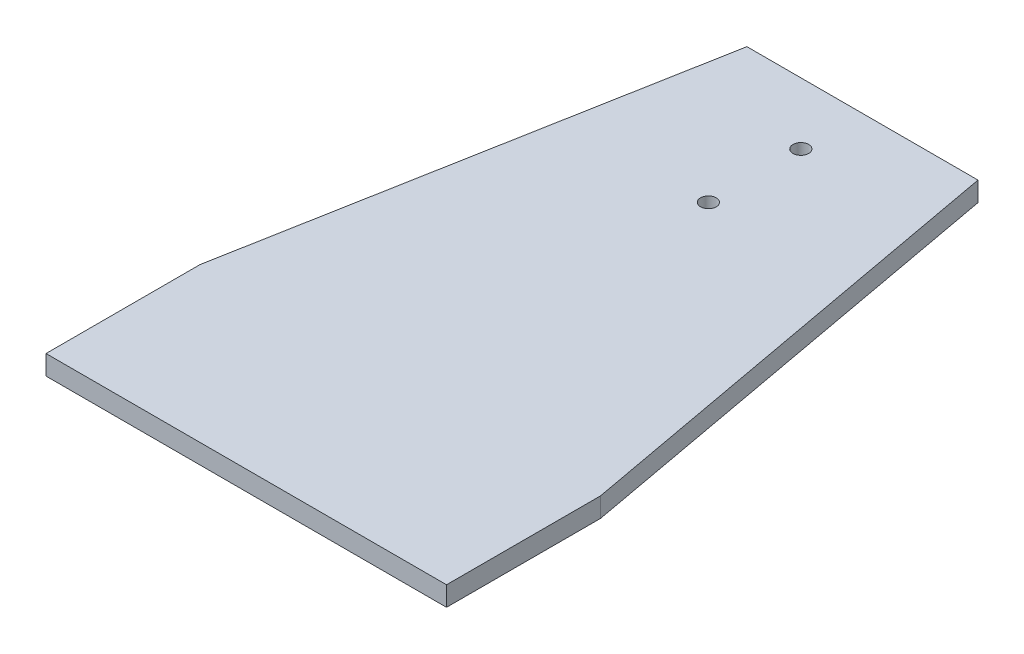
ISO-10303-21;
HEADER;
FILE_DESCRIPTION(('STEP AP214'),'2;1');
FILE_NAME('part.step','',(''),(''),'','','');
FILE_SCHEMA(('AUTOMOTIVE_DESIGN { 1 0 10303 214 1 1 1 1 }'));
ENDSEC;
DATA;
#1=APPLICATION_CONTEXT('core data for automotive mechanical design processes');
#2=APPLICATION_PROTOCOL_DEFINITION('international standard','automotive_design',2000,#1);
#3=PRODUCT_CONTEXT('',#1,'mechanical');
#4=PRODUCT('Part','Part','',(#3));
#5=PRODUCT_RELATED_PRODUCT_CATEGORY('part','',(#4));
#6=PRODUCT_DEFINITION_FORMATION('','',#4);
#7=PRODUCT_DEFINITION_CONTEXT('part definition',#1,'design');
#8=PRODUCT_DEFINITION('design','',#6,#7);
#9=PRODUCT_DEFINITION_SHAPE('','',#8);
#10=(LENGTH_UNIT() NAMED_UNIT(*) SI_UNIT(.MILLI.,.METRE.));
#11=(NAMED_UNIT(*) PLANE_ANGLE_UNIT() SI_UNIT($,.RADIAN.));
#12=(NAMED_UNIT(*) SI_UNIT($,.STERADIAN.) SOLID_ANGLE_UNIT());
#13=UNCERTAINTY_MEASURE_WITH_UNIT(LENGTH_MEASURE(1.E-05),#10,'distance_accuracy_value','');
#14=(GEOMETRIC_REPRESENTATION_CONTEXT(3) GLOBAL_UNCERTAINTY_ASSIGNED_CONTEXT((#13)) GLOBAL_UNIT_ASSIGNED_CONTEXT((#10,
#11,#12)) REPRESENTATION_CONTEXT('',''));
#15=CARTESIAN_POINT('',(0.,0.,0.));
#16=DIRECTION('',(0.,0.,1.));
#17=DIRECTION('',(1.,0.,0.));
#18=AXIS2_PLACEMENT_3D('',#15,#16,#17);
#19=CARTESIAN_POINT('',(0.,6.35,0.));
#20=DIRECTION('',(0.,1.,0.));
#21=DIRECTION('',(0.,0.,1.));
#22=AXIS2_PLACEMENT_3D('',#19,#20,#21);
#23=PLANE('',#22);
#24=CARTESIAN_POINT('',(0.,6.35,-155.));
#25=DIRECTION('',(0.,1.,0.));
#26=DIRECTION('',(0.,0.,1.));
#27=AXIS2_PLACEMENT_3D('',#24,#25,#26);
#28=CIRCLE('',#27,2.55);
#29=CARTESIAN_POINT('',(0.,6.35,-152.45));
#30=VERTEX_POINT('',#29);
#31=EDGE_CURVE('E144',#30,#30,#28,.T.);
#32=ORIENTED_EDGE('',*,*,#31,.F.);
#33=EDGE_LOOP('',(#32));
#34=FACE_BOUND('',#33,.T.);
#35=DIRECTION('',(0.,0.,-1.));
#36=VECTOR('',#35,1.);
#37=CARTESIAN_POINT('',(65.,6.35,-25.));
#38=LINE('',#37,#36);
#39=CARTESIAN_POINT('',(65.,6.35,25.));
#40=VERTEX_POINT('',#39);
#41=CARTESIAN_POINT('',(65.,6.35,-25.));
#42=VERTEX_POINT('',#41);
#43=EDGE_CURVE('E137',#40,#42,#38,.T.);
#44=ORIENTED_EDGE('',*,*,#43,.T.);
#45=DIRECTION('',(-0.180327868852459,0.,-0.983606557377049));
#46=VECTOR('',#45,1.);
#47=CARTESIAN_POINT('',(37.5,6.35,-175.));
#48=LINE('',#47,#46);
#49=CARTESIAN_POINT('',(37.5,6.35,-175.));
#50=VERTEX_POINT('',#49);
#51=EDGE_CURVE('E89',#42,#50,#48,.T.);
#52=ORIENTED_EDGE('',*,*,#51,.T.);
#53=DIRECTION('',(-1.,0.,0.));
#54=VECTOR('',#53,1.);
#55=CARTESIAN_POINT('',(-37.5,6.35,-175.));
#56=LINE('',#55,#54);
#57=CARTESIAN_POINT('',(-37.5,6.35,-175.));
#58=VERTEX_POINT('',#57);
#59=EDGE_CURVE('E102',#50,#58,#56,.T.);
#60=ORIENTED_EDGE('',*,*,#59,.T.);
#61=DIRECTION('',(-0.180327868852459,0.,0.983606557377049));
#62=VECTOR('',#61,1.);
#63=CARTESIAN_POINT('',(-37.5,6.35,-175.));
#64=LINE('',#63,#62);
#65=CARTESIAN_POINT('',(-65.,6.35,-25.));
#66=VERTEX_POINT('',#65);
#67=EDGE_CURVE('E96',#58,#66,#64,.T.);
#68=ORIENTED_EDGE('',*,*,#67,.T.);
#69=DIRECTION('',(0.,0.,1.));
#70=VECTOR('',#69,1.);
#71=CARTESIAN_POINT('',(-65.,6.35,-25.));
#72=LINE('',#71,#70);
#73=CARTESIAN_POINT('',(-65.,6.35,25.));
#74=VERTEX_POINT('',#73);
#75=EDGE_CURVE('E100',#66,#74,#72,.T.);
#76=ORIENTED_EDGE('',*,*,#75,.T.);
#77=DIRECTION('',(1.,0.,0.));
#78=VECTOR('',#77,1.);
#79=CARTESIAN_POINT('',(-65.,6.35,25.));
#80=LINE('',#79,#78);
#81=EDGE_CURVE('E52',#74,#40,#80,.T.);
#82=ORIENTED_EDGE('',*,*,#81,.T.);
#83=EDGE_LOOP('',(#44,#52,#60,#68,#76,#82));
#84=FACE_BOUND('',#83,.T.);
#85=CARTESIAN_POINT('',(0.,6.35,-125.));
#86=DIRECTION('',(0.,1.,0.));
#87=DIRECTION('',(0.,0.,1.));
#88=AXIS2_PLACEMENT_3D('',#85,#86,#87);
#89=CIRCLE('',#88,2.55);
#90=CARTESIAN_POINT('',(0.,6.35,-122.45));
#91=VERTEX_POINT('',#90);
#92=EDGE_CURVE('E152',#91,#91,#89,.T.);
#93=ORIENTED_EDGE('',*,*,#92,.F.);
#94=EDGE_LOOP('',(#93));
#95=FACE_BOUND('',#94,.T.);
#96=ADVANCED_FACE('F35',(#34,#84,#95),#23,.T.);
#97=CARTESIAN_POINT('',(0.,0.,0.));
#98=DIRECTION('',(0.,1.,0.));
#99=DIRECTION('',(0.,0.,1.));
#100=AXIS2_PLACEMENT_3D('',#97,#98,#99);
#101=PLANE('',#100);
#102=DIRECTION('',(0.,0.,-1.));
#103=VECTOR('',#102,1.);
#104=CARTESIAN_POINT('',(65.,0.,-25.));
#105=LINE('',#104,#103);
#106=CARTESIAN_POINT('',(65.,0.,25.));
#107=VERTEX_POINT('',#106);
#108=CARTESIAN_POINT('',(65.,0.,-25.));
#109=VERTEX_POINT('',#108);
#110=EDGE_CURVE('E149',#107,#109,#105,.T.);
#111=ORIENTED_EDGE('',*,*,#110,.F.);
#112=DIRECTION('',(1.,0.,0.));
#113=VECTOR('',#112,1.);
#114=CARTESIAN_POINT('',(-65.,0.,25.));
#115=LINE('',#114,#113);
#116=CARTESIAN_POINT('',(-65.,0.,25.));
#117=VERTEX_POINT('',#116);
#118=EDGE_CURVE('E81',#117,#107,#115,.T.);
#119=ORIENTED_EDGE('',*,*,#118,.F.);
#120=DIRECTION('',(0.,0.,1.));
#121=VECTOR('',#120,1.);
#122=CARTESIAN_POINT('',(-65.,0.,-25.));
#123=LINE('',#122,#121);
#124=CARTESIAN_POINT('',(-65.,0.,-25.));
#125=VERTEX_POINT('',#124);
#126=EDGE_CURVE('E75',#125,#117,#123,.T.);
#127=ORIENTED_EDGE('',*,*,#126,.F.);
#128=DIRECTION('',(-0.180327868852459,0.,0.983606557377049));
#129=VECTOR('',#128,1.);
#130=CARTESIAN_POINT('',(-37.5,0.,-175.));
#131=LINE('',#130,#129);
#132=CARTESIAN_POINT('',(-37.5,0.,-175.));
#133=VERTEX_POINT('',#132);
#134=EDGE_CURVE('E111',#133,#125,#131,.T.);
#135=ORIENTED_EDGE('',*,*,#134,.F.);
#136=DIRECTION('',(-1.,0.,0.));
#137=VECTOR('',#136,1.);
#138=CARTESIAN_POINT('',(-37.5,0.,-175.));
#139=LINE('',#138,#137);
#140=CARTESIAN_POINT('',(37.5,0.,-175.));
#141=VERTEX_POINT('',#140);
#142=EDGE_CURVE('E205',#141,#133,#139,.T.);
#143=ORIENTED_EDGE('',*,*,#142,.F.);
#144=DIRECTION('',(-0.180327868852459,0.,-0.983606557377049));
#145=VECTOR('',#144,1.);
#146=CARTESIAN_POINT('',(37.5,0.,-175.));
#147=LINE('',#146,#145);
#148=EDGE_CURVE('E199',#109,#141,#147,.T.);
#149=ORIENTED_EDGE('',*,*,#148,.F.);
#150=EDGE_LOOP('',(#111,#119,#127,#135,#143,#149));
#151=FACE_BOUND('',#150,.T.);
#152=CARTESIAN_POINT('',(0.,0.,-155.));
#153=DIRECTION('',(0.,1.,0.));
#154=DIRECTION('',(0.,0.,1.));
#155=AXIS2_PLACEMENT_3D('',#152,#153,#154);
#156=CIRCLE('',#155,2.55);
#157=CARTESIAN_POINT('',(0.,0.,-152.45));
#158=VERTEX_POINT('',#157);
#159=EDGE_CURVE('E141',#158,#158,#156,.T.);
#160=ORIENTED_EDGE('',*,*,#159,.T.);
#161=EDGE_LOOP('',(#160));
#162=FACE_BOUND('',#161,.T.);
#163=CARTESIAN_POINT('',(0.,0.,-125.));
#164=DIRECTION('',(0.,1.,0.));
#165=DIRECTION('',(0.,0.,1.));
#166=AXIS2_PLACEMENT_3D('',#163,#164,#165);
#167=CIRCLE('',#166,2.55);
#168=CARTESIAN_POINT('',(0.,0.,-122.45));
#169=VERTEX_POINT('',#168);
#170=EDGE_CURVE('E150',#169,#169,#167,.T.);
#171=ORIENTED_EDGE('',*,*,#170,.T.);
#172=EDGE_LOOP('',(#171));
#173=FACE_BOUND('',#172,.T.);
#174=ADVANCED_FACE('F161',(#151,#162,#173),#101,.F.);
#175=CARTESIAN_POINT('',(65.,6.35,-25.));
#176=DIRECTION('',(-1.,0.,0.));
#177=DIRECTION('',(0.,0.,1.));
#178=AXIS2_PLACEMENT_3D('',#175,#176,#177);
#179=PLANE('',#178);
#180=ORIENTED_EDGE('',*,*,#110,.T.);
#181=DIRECTION('',(0.,-1.,0.));
#182=VECTOR('',#181,1.);
#183=CARTESIAN_POINT('',(65.,6.35,-25.));
#184=LINE('',#183,#182);
#185=EDGE_CURVE('E12',#42,#109,#184,.T.);
#186=ORIENTED_EDGE('',*,*,#185,.F.);
#187=ORIENTED_EDGE('',*,*,#43,.F.);
#188=DIRECTION('',(0.,-1.,0.));
#189=VECTOR('',#188,1.);
#190=CARTESIAN_POINT('',(65.,6.35,25.));
#191=LINE('',#190,#189);
#192=EDGE_CURVE('E119',#40,#107,#191,.T.);
#193=ORIENTED_EDGE('',*,*,#192,.T.);
#194=EDGE_LOOP('',(#180,#186,#187,#193));
#195=FACE_BOUND('',#194,.T.);
#196=ADVANCED_FACE('F37',(#195),#179,.F.);
#197=CARTESIAN_POINT('',(37.5,6.35,-175.));
#198=DIRECTION('',(-0.983606557377049,0.,0.180327868852459));
#199=DIRECTION('',(0.180327868852459,0.,0.983606557377049));
#200=AXIS2_PLACEMENT_3D('',#197,#198,#199);
#201=PLANE('',#200);
#202=ORIENTED_EDGE('',*,*,#148,.T.);
#203=DIRECTION('',(0.,-1.,0.));
#204=VECTOR('',#203,1.);
#205=CARTESIAN_POINT('',(37.5,6.35,-175.));
#206=LINE('',#205,#204);
#207=EDGE_CURVE('E44',#50,#141,#206,.T.);
#208=ORIENTED_EDGE('',*,*,#207,.F.);
#209=ORIENTED_EDGE('',*,*,#51,.F.);
#210=ORIENTED_EDGE('',*,*,#185,.T.);
#211=EDGE_LOOP('',(#202,#208,#209,#210));
#212=FACE_BOUND('',#211,.T.);
#213=ADVANCED_FACE('F192',(#212),#201,.F.);
#214=CARTESIAN_POINT('',(-37.5,6.35,-175.));
#215=DIRECTION('',(0.,0.,1.));
#216=DIRECTION('',(1.,0.,0.));
#217=AXIS2_PLACEMENT_3D('',#214,#215,#216);
#218=PLANE('',#217);
#219=ORIENTED_EDGE('',*,*,#142,.T.);
#220=DIRECTION('',(0.,-1.,0.));
#221=VECTOR('',#220,1.);
#222=CARTESIAN_POINT('',(-37.5,6.35,-175.));
#223=LINE('',#222,#221);
#224=EDGE_CURVE('E112',#58,#133,#223,.T.);
#225=ORIENTED_EDGE('',*,*,#224,.F.);
#226=ORIENTED_EDGE('',*,*,#59,.F.);
#227=ORIENTED_EDGE('',*,*,#207,.T.);
#228=EDGE_LOOP('',(#219,#225,#226,#227));
#229=FACE_BOUND('',#228,.T.);
#230=ADVANCED_FACE('F190',(#229),#218,.F.);
#231=CARTESIAN_POINT('',(-37.5,6.35,-175.));
#232=DIRECTION('',(0.983606557377049,0.,0.180327868852459));
#233=DIRECTION('',(0.180327868852459,0.,-0.983606557377049));
#234=AXIS2_PLACEMENT_3D('',#231,#232,#233);
#235=PLANE('',#234);
#236=ORIENTED_EDGE('',*,*,#134,.T.);
#237=DIRECTION('',(0.,-1.,0.));
#238=VECTOR('',#237,1.);
#239=CARTESIAN_POINT('',(-65.,6.35,-25.));
#240=LINE('',#239,#238);
#241=EDGE_CURVE('E108',#66,#125,#240,.T.);
#242=ORIENTED_EDGE('',*,*,#241,.F.);
#243=ORIENTED_EDGE('',*,*,#67,.F.);
#244=ORIENTED_EDGE('',*,*,#224,.T.);
#245=EDGE_LOOP('',(#236,#242,#243,#244));
#246=FACE_BOUND('',#245,.T.);
#247=ADVANCED_FACE('F109',(#246),#235,.F.);
#248=CARTESIAN_POINT('',(-65.,6.35,-25.));
#249=DIRECTION('',(1.,0.,0.));
#250=DIRECTION('',(0.,0.,-1.));
#251=AXIS2_PLACEMENT_3D('',#248,#249,#250);
#252=PLANE('',#251);
#253=ORIENTED_EDGE('',*,*,#126,.T.);
#254=DIRECTION('',(0.,-1.,0.));
#255=VECTOR('',#254,1.);
#256=CARTESIAN_POINT('',(-65.,6.35,25.));
#257=LINE('',#256,#255);
#258=EDGE_CURVE('E113',#74,#117,#257,.T.);
#259=ORIENTED_EDGE('',*,*,#258,.F.);
#260=ORIENTED_EDGE('',*,*,#75,.F.);
#261=ORIENTED_EDGE('',*,*,#241,.T.);
#262=EDGE_LOOP('',(#253,#259,#260,#261));
#263=FACE_BOUND('',#262,.T.);
#264=ADVANCED_FACE('F115',(#263),#252,.F.);
#265=CARTESIAN_POINT('',(-65.,6.35,25.));
#266=DIRECTION('',(0.,0.,-1.));
#267=DIRECTION('',(-1.,0.,0.));
#268=AXIS2_PLACEMENT_3D('',#265,#266,#267);
#269=PLANE('',#268);
#270=ORIENTED_EDGE('',*,*,#118,.T.);
#271=ORIENTED_EDGE('',*,*,#192,.F.);
#272=ORIENTED_EDGE('',*,*,#81,.F.);
#273=ORIENTED_EDGE('',*,*,#258,.T.);
#274=EDGE_LOOP('',(#270,#271,#272,#273));
#275=FACE_BOUND('',#274,.T.);
#276=ADVANCED_FACE('F167',(#275),#269,.F.);
#277=CARTESIAN_POINT('',(0.,6.35,-155.));
#278=DIRECTION('',(0.,-1.,0.));
#279=DIRECTION('',(0.,0.,-1.));
#280=AXIS2_PLACEMENT_3D('',#277,#278,#279);
#281=CYLINDRICAL_SURFACE('',#280,2.55);
#282=ORIENTED_EDGE('',*,*,#31,.T.);
#283=EDGE_LOOP('',(#282));
#284=FACE_BOUND('',#283,.T.);
#285=ORIENTED_EDGE('',*,*,#159,.F.);
#286=EDGE_LOOP('',(#285));
#287=FACE_BOUND('',#286,.T.);
#288=ADVANCED_FACE('F164',(#284,#287),#281,.F.);
#289=CARTESIAN_POINT('',(0.,6.35,-125.));
#290=DIRECTION('',(0.,-1.,0.));
#291=DIRECTION('',(0.,0.,-1.));
#292=AXIS2_PLACEMENT_3D('',#289,#290,#291);
#293=CYLINDRICAL_SURFACE('',#292,2.55);
#294=ORIENTED_EDGE('',*,*,#92,.T.);
#295=EDGE_LOOP('',(#294));
#296=FACE_BOUND('',#295,.T.);
#297=ORIENTED_EDGE('',*,*,#170,.F.);
#298=EDGE_LOOP('',(#297));
#299=FACE_BOUND('',#298,.T.);
#300=ADVANCED_FACE('F166',(#296,#299),#293,.F.);
#301=CLOSED_SHELL('',(#96,#174,#196,#213,#230,#247,#264,#276,#288,#300));
#302=MANIFOLD_SOLID_BREP('B2',#301);
#303=ADVANCED_BREP_SHAPE_REPRESENTATION('',(#18,#302),#14);
#304=SHAPE_DEFINITION_REPRESENTATION(#9,#303);
ENDSEC;
END-ISO-10303-21;
